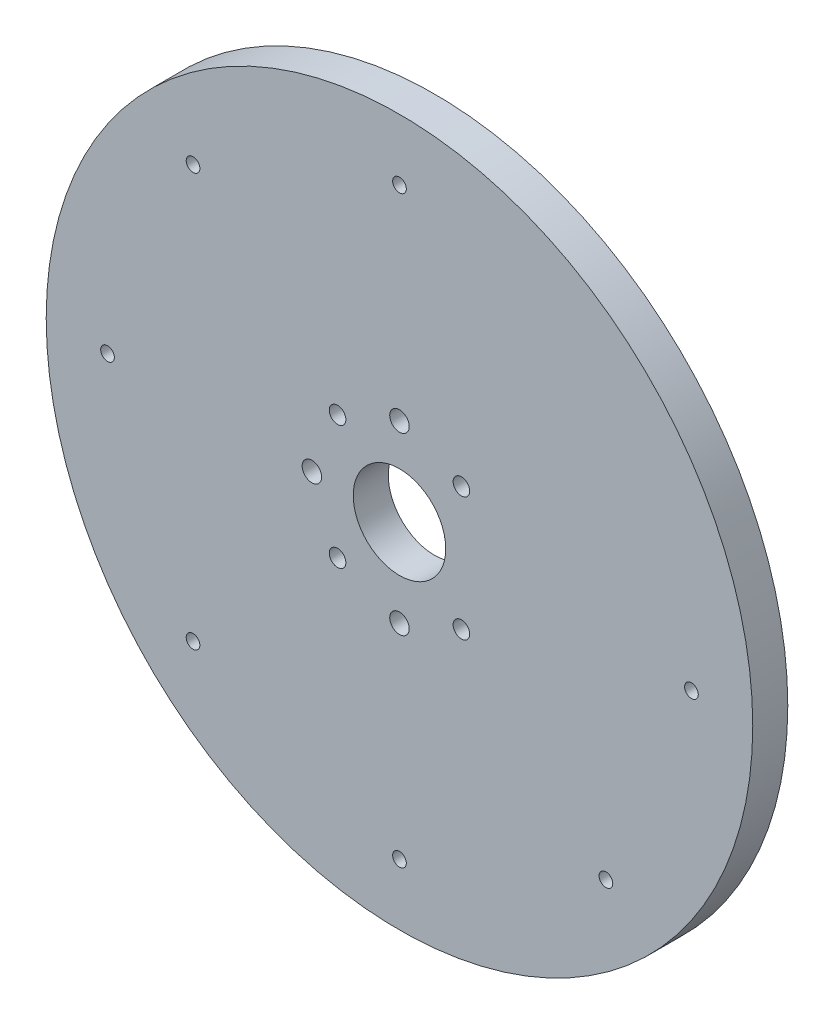
ISO-10303-21;
HEADER;
FILE_DESCRIPTION(('STEP AP214'),'2;1');
FILE_NAME('part.step','',(''),(''),'','','');
FILE_SCHEMA(('AUTOMOTIVE_DESIGN { 1 0 10303 214 1 1 1 1 }'));
ENDSEC;
DATA;
#1=APPLICATION_CONTEXT('core data for automotive mechanical design processes');
#2=APPLICATION_PROTOCOL_DEFINITION('international standard','automotive_design',2000,#1);
#3=PRODUCT_CONTEXT('',#1,'mechanical');
#4=PRODUCT('Part','Part','',(#3));
#5=PRODUCT_RELATED_PRODUCT_CATEGORY('part','',(#4));
#6=PRODUCT_DEFINITION_FORMATION('','',#4);
#7=PRODUCT_DEFINITION_CONTEXT('part definition',#1,'design');
#8=PRODUCT_DEFINITION('design','',#6,#7);
#9=PRODUCT_DEFINITION_SHAPE('','',#8);
#10=(LENGTH_UNIT() NAMED_UNIT(*) SI_UNIT(.MILLI.,.METRE.));
#11=(NAMED_UNIT(*) PLANE_ANGLE_UNIT() SI_UNIT($,.RADIAN.));
#12=(NAMED_UNIT(*) SI_UNIT($,.STERADIAN.) SOLID_ANGLE_UNIT());
#13=UNCERTAINTY_MEASURE_WITH_UNIT(LENGTH_MEASURE(1.E-05),#10,'distance_accuracy_value','');
#14=(GEOMETRIC_REPRESENTATION_CONTEXT(3) GLOBAL_UNCERTAINTY_ASSIGNED_CONTEXT((#13)) GLOBAL_UNIT_ASSIGNED_CONTEXT((#10,
#11,#12)) REPRESENTATION_CONTEXT('',''));
#15=CARTESIAN_POINT('',(0.,0.,0.));
#16=DIRECTION('',(0.,0.,1.));
#17=DIRECTION('',(1.,0.,0.));
#18=AXIS2_PLACEMENT_3D('',#15,#16,#17);
#19=CARTESIAN_POINT('',(0.,0.,6.));
#20=DIRECTION('',(0.,0.,1.));
#21=DIRECTION('',(1.,0.,0.));
#22=AXIS2_PLACEMENT_3D('',#19,#20,#21);
#23=PLANE('',#22);
#24=CARTESIAN_POINT('',(1.68358407260694E-13,50.,6.));
#25=DIRECTION('',(0.,0.,1.));
#26=DIRECTION('',(1.,0.,0.));
#27=AXIS2_PLACEMENT_3D('',#24,#25,#26);
#28=CIRCLE('',#27,1.17);
#29=CARTESIAN_POINT('',(1.17000000000017,50.,6.));
#30=VERTEX_POINT('',#29);
#31=EDGE_CURVE('E60',#30,#30,#28,.T.);
#32=ORIENTED_EDGE('',*,*,#31,.F.);
#33=EDGE_LOOP('',(#32));
#34=FACE_BOUND('',#33,.T.);
#35=CARTESIAN_POINT('',(-50.,1.74574066942157E-13,6.));
#36=DIRECTION('',(0.,0.,1.));
#37=DIRECTION('',(1.,0.,0.));
#38=AXIS2_PLACEMENT_3D('',#35,#36,#37);
#39=CIRCLE('',#38,1.17);
#40=CARTESIAN_POINT('',(-48.83,1.74574066942157E-13,6.));
#41=VERTEX_POINT('',#40);
#42=EDGE_CURVE('E72',#41,#41,#39,.T.);
#43=ORIENTED_EDGE('',*,*,#42,.F.);
#44=EDGE_LOOP('',(#43));
#45=FACE_BOUND('',#44,.T.);
#46=CARTESIAN_POINT('',(-10.6066017177982,10.6066017177983,6.));
#47=DIRECTION('',(0.,0.,1.));
#48=DIRECTION('',(1.,0.,0.));
#49=AXIS2_PLACEMENT_3D('',#46,#47,#48);
#50=CIRCLE('',#49,1.42);
#51=CARTESIAN_POINT('',(-9.18660171779816,10.6066017177983,6.));
#52=VERTEX_POINT('',#51);
#53=EDGE_CURVE('E84',#52,#52,#50,.T.);
#54=ORIENTED_EDGE('',*,*,#53,.F.);
#55=EDGE_LOOP('',(#54));
#56=FACE_BOUND('',#55,.T.);
#57=CARTESIAN_POINT('',(-10.6066017177982,-10.6066017177982,6.));
#58=DIRECTION('',(0.,0.,1.));
#59=DIRECTION('',(1.,0.,0.));
#60=AXIS2_PLACEMENT_3D('',#57,#58,#59);
#61=CIRCLE('',#60,1.42);
#62=CARTESIAN_POINT('',(-9.18660171779823,-10.6066017177982,6.));
#63=VERTEX_POINT('',#62);
#64=EDGE_CURVE('E96',#63,#63,#61,.T.);
#65=ORIENTED_EDGE('',*,*,#64,.F.);
#66=EDGE_LOOP('',(#65));
#67=FACE_BOUND('',#66,.T.);
#68=CARTESIAN_POINT('',(-35.3553390593274,-35.3553390593273,6.));
#69=DIRECTION('',(0.,0.,1.));
#70=DIRECTION('',(1.,0.,0.));
#71=AXIS2_PLACEMENT_3D('',#68,#69,#70);
#72=CIRCLE('',#71,1.17);
#73=CARTESIAN_POINT('',(-34.1853390593274,-35.3553390593273,6.));
#74=VERTEX_POINT('',#73);
#75=EDGE_CURVE('E108',#74,#74,#72,.T.);
#76=ORIENTED_EDGE('',*,*,#75,.F.);
#77=EDGE_LOOP('',(#76));
#78=FACE_BOUND('',#77,.T.);
#79=CARTESIAN_POINT('',(10.6066017177982,-10.6066017177982,6.));
#80=DIRECTION('',(0.,0.,1.));
#81=DIRECTION('',(1.,0.,0.));
#82=AXIS2_PLACEMENT_3D('',#79,#80,#81);
#83=CIRCLE('',#82,1.42);
#84=CARTESIAN_POINT('',(12.0266017177982,-10.6066017177982,6.));
#85=VERTEX_POINT('',#84);
#86=EDGE_CURVE('E120',#85,#85,#83,.T.);
#87=ORIENTED_EDGE('',*,*,#86,.F.);
#88=EDGE_LOOP('',(#87));
#89=FACE_BOUND('',#88,.T.);
#90=CARTESIAN_POINT('',(0.,0.,6.));
#91=DIRECTION('',(0.,0.,1.));
#92=DIRECTION('',(1.,0.,0.));
#93=AXIS2_PLACEMENT_3D('',#90,#91,#92);
#94=CIRCLE('',#93,7.92);
#95=CARTESIAN_POINT('',(7.92,0.,6.));
#96=VERTEX_POINT('',#95);
#97=EDGE_CURVE('E52',#96,#96,#94,.T.);
#98=ORIENTED_EDGE('',*,*,#97,.F.);
#99=EDGE_LOOP('',(#98));
#100=FACE_BOUND('',#99,.T.);
#101=CARTESIAN_POINT('',(0.,0.,6.));
#102=DIRECTION('',(0.,0.,1.));
#103=DIRECTION('',(1.,0.,0.));
#104=AXIS2_PLACEMENT_3D('',#101,#102,#103);
#105=CIRCLE('',#104,60.5);
#106=CARTESIAN_POINT('',(60.5,0.,6.));
#107=VERTEX_POINT('',#106);
#108=EDGE_CURVE('E11',#107,#107,#105,.T.);
#109=ORIENTED_EDGE('',*,*,#108,.T.);
#110=EDGE_LOOP('',(#109));
#111=FACE_BOUND('',#110,.T.);
#112=CARTESIAN_POINT('',(35.3553390593276,-35.3553390593272,6.));
#113=DIRECTION('',(0.,0.,1.));
#114=DIRECTION('',(1.,0.,0.));
#115=AXIS2_PLACEMENT_3D('',#112,#113,#114);
#116=CIRCLE('',#115,1.17);
#117=CARTESIAN_POINT('',(36.5253390593276,-35.3553390593272,6.));
#118=VERTEX_POINT('',#117);
#119=EDGE_CURVE('E44',#118,#118,#116,.T.);
#120=ORIENTED_EDGE('',*,*,#119,.F.);
#121=EDGE_LOOP('',(#120));
#122=FACE_BOUND('',#121,.T.);
#123=CARTESIAN_POINT('',(0.,-15.,6.));
#124=DIRECTION('',(0.,0.,1.));
#125=DIRECTION('',(1.,0.,0.));
#126=AXIS2_PLACEMENT_3D('',#123,#124,#125);
#127=CIRCLE('',#126,1.67);
#128=CARTESIAN_POINT('',(1.67,-15.,6.));
#129=VERTEX_POINT('',#128);
#130=EDGE_CURVE('E126',#129,#129,#127,.T.);
#131=ORIENTED_EDGE('',*,*,#130,.F.);
#132=EDGE_LOOP('',(#131));
#133=FACE_BOUND('',#132,.T.);
#134=CARTESIAN_POINT('',(0.,-50.,6.));
#135=DIRECTION('',(0.,0.,1.));
#136=DIRECTION('',(1.,0.,0.));
#137=AXIS2_PLACEMENT_3D('',#134,#135,#136);
#138=CIRCLE('',#137,1.17);
#139=CARTESIAN_POINT('',(1.17,-50.,6.));
#140=VERTEX_POINT('',#139);
#141=EDGE_CURVE('E114',#140,#140,#138,.T.);
#142=ORIENTED_EDGE('',*,*,#141,.F.);
#143=EDGE_LOOP('',(#142));
#144=FACE_BOUND('',#143,.T.);
#145=CARTESIAN_POINT('',(-15.,0.,6.));
#146=DIRECTION('',(0.,0.,1.));
#147=DIRECTION('',(1.,0.,0.));
#148=AXIS2_PLACEMENT_3D('',#145,#146,#147);
#149=CIRCLE('',#148,1.67);
#150=CARTESIAN_POINT('',(-13.33,0.,6.));
#151=VERTEX_POINT('',#150);
#152=EDGE_CURVE('E102',#151,#151,#149,.T.);
#153=ORIENTED_EDGE('',*,*,#152,.F.);
#154=EDGE_LOOP('',(#153));
#155=FACE_BOUND('',#154,.T.);
#156=CARTESIAN_POINT('',(1.04744440165294E-13,15.,6.));
#157=DIRECTION('',(0.,0.,1.));
#158=DIRECTION('',(1.,0.,0.));
#159=AXIS2_PLACEMENT_3D('',#156,#157,#158);
#160=CIRCLE('',#159,1.67);
#161=CARTESIAN_POINT('',(1.6700000000001,15.,6.));
#162=VERTEX_POINT('',#161);
#163=EDGE_CURVE('E90',#162,#162,#160,.T.);
#164=ORIENTED_EDGE('',*,*,#163,.F.);
#165=EDGE_LOOP('',(#164));
#166=FACE_BOUND('',#165,.T.);
#167=CARTESIAN_POINT('',(10.6066017177983,10.6066017177981,6.));
#168=DIRECTION('',(0.,0.,1.));
#169=DIRECTION('',(1.,0.,0.));
#170=AXIS2_PLACEMENT_3D('',#167,#168,#169);
#171=CIRCLE('',#170,1.42);
#172=CARTESIAN_POINT('',(12.0266017177983,10.6066017177981,6.));
#173=VERTEX_POINT('',#172);
#174=EDGE_CURVE('E78',#173,#173,#171,.T.);
#175=ORIENTED_EDGE('',*,*,#174,.F.);
#176=EDGE_LOOP('',(#175));
#177=FACE_BOUND('',#176,.T.);
#178=CARTESIAN_POINT('',(-35.3553390593272,35.3553390593276,6.));
#179=DIRECTION('',(0.,0.,1.));
#180=DIRECTION('',(1.,0.,0.));
#181=AXIS2_PLACEMENT_3D('',#178,#179,#180);
#182=CIRCLE('',#181,1.17);
#183=CARTESIAN_POINT('',(-34.1853390593272,35.3553390593276,6.));
#184=VERTEX_POINT('',#183);
#185=EDGE_CURVE('E66',#184,#184,#182,.T.);
#186=ORIENTED_EDGE('',*,*,#185,.F.);
#187=EDGE_LOOP('',(#186));
#188=FACE_BOUND('',#187,.T.);
#189=CARTESIAN_POINT('',(50.,0.,6.));
#190=DIRECTION('',(0.,0.,1.));
#191=DIRECTION('',(1.,0.,0.));
#192=AXIS2_PLACEMENT_3D('',#189,#190,#191);
#193=CIRCLE('',#192,1.17);
#194=CARTESIAN_POINT('',(51.17,0.,6.));
#195=VERTEX_POINT('',#194);
#196=EDGE_CURVE('E53',#195,#195,#193,.T.);
#197=ORIENTED_EDGE('',*,*,#196,.F.);
#198=EDGE_LOOP('',(#197));
#199=FACE_BOUND('',#198,.T.);
#200=ADVANCED_FACE('F31',(#34,#45,#56,#67,#78,#89,#100,#111,#122,#133,#144,#155,#166,#177,#188,
#199),#23,.T.);
#201=CARTESIAN_POINT('',(0.,0.,0.));
#202=DIRECTION('',(0.,0.,1.));
#203=DIRECTION('',(1.,0.,0.));
#204=AXIS2_PLACEMENT_3D('',#201,#202,#203);
#205=PLANE('',#204);
#206=CARTESIAN_POINT('',(1.68358407260694E-13,50.,0.));
#207=DIRECTION('',(0.,0.,1.));
#208=DIRECTION('',(1.,0.,0.));
#209=AXIS2_PLACEMENT_3D('',#206,#207,#208);
#210=CIRCLE('',#209,1.17);
#211=CARTESIAN_POINT('',(1.17000000000017,50.,0.));
#212=VERTEX_POINT('',#211);
#213=EDGE_CURVE('E56',#212,#212,#210,.T.);
#214=ORIENTED_EDGE('',*,*,#213,.T.);
#215=EDGE_LOOP('',(#214));
#216=FACE_BOUND('',#215,.T.);
#217=CARTESIAN_POINT('',(-50.,1.74574066942157E-13,0.));
#218=DIRECTION('',(0.,0.,1.));
#219=DIRECTION('',(1.,0.,0.));
#220=AXIS2_PLACEMENT_3D('',#217,#218,#219);
#221=CIRCLE('',#220,1.17);
#222=CARTESIAN_POINT('',(-48.83,1.74574066942157E-13,0.));
#223=VERTEX_POINT('',#222);
#224=EDGE_CURVE('E69',#223,#223,#221,.T.);
#225=ORIENTED_EDGE('',*,*,#224,.T.);
#226=EDGE_LOOP('',(#225));
#227=FACE_BOUND('',#226,.T.);
#228=CARTESIAN_POINT('',(-10.6066017177982,10.6066017177983,0.));
#229=DIRECTION('',(0.,0.,1.));
#230=DIRECTION('',(1.,0.,0.));
#231=AXIS2_PLACEMENT_3D('',#228,#229,#230);
#232=CIRCLE('',#231,1.42);
#233=CARTESIAN_POINT('',(-9.18660171779816,10.6066017177983,0.));
#234=VERTEX_POINT('',#233);
#235=EDGE_CURVE('E81',#234,#234,#232,.T.);
#236=ORIENTED_EDGE('',*,*,#235,.T.);
#237=EDGE_LOOP('',(#236));
#238=FACE_BOUND('',#237,.T.);
#239=CARTESIAN_POINT('',(-10.6066017177982,-10.6066017177982,0.));
#240=DIRECTION('',(0.,0.,1.));
#241=DIRECTION('',(1.,0.,0.));
#242=AXIS2_PLACEMENT_3D('',#239,#240,#241);
#243=CIRCLE('',#242,1.42);
#244=CARTESIAN_POINT('',(-9.18660171779823,-10.6066017177982,0.));
#245=VERTEX_POINT('',#244);
#246=EDGE_CURVE('E93',#245,#245,#243,.T.);
#247=ORIENTED_EDGE('',*,*,#246,.T.);
#248=EDGE_LOOP('',(#247));
#249=FACE_BOUND('',#248,.T.);
#250=CARTESIAN_POINT('',(-35.3553390593274,-35.3553390593273,0.));
#251=DIRECTION('',(0.,0.,1.));
#252=DIRECTION('',(1.,0.,0.));
#253=AXIS2_PLACEMENT_3D('',#250,#251,#252);
#254=CIRCLE('',#253,1.17);
#255=CARTESIAN_POINT('',(-34.1853390593274,-35.3553390593273,0.));
#256=VERTEX_POINT('',#255);
#257=EDGE_CURVE('E105',#256,#256,#254,.T.);
#258=ORIENTED_EDGE('',*,*,#257,.T.);
#259=EDGE_LOOP('',(#258));
#260=FACE_BOUND('',#259,.T.);
#261=CARTESIAN_POINT('',(10.6066017177982,-10.6066017177982,0.));
#262=DIRECTION('',(0.,0.,1.));
#263=DIRECTION('',(1.,0.,0.));
#264=AXIS2_PLACEMENT_3D('',#261,#262,#263);
#265=CIRCLE('',#264,1.42);
#266=CARTESIAN_POINT('',(12.0266017177982,-10.6066017177982,0.));
#267=VERTEX_POINT('',#266);
#268=EDGE_CURVE('E117',#267,#267,#265,.T.);
#269=ORIENTED_EDGE('',*,*,#268,.T.);
#270=EDGE_LOOP('',(#269));
#271=FACE_BOUND('',#270,.T.);
#272=CARTESIAN_POINT('',(0.,0.,0.));
#273=DIRECTION('',(0.,0.,1.));
#274=DIRECTION('',(1.,0.,0.));
#275=AXIS2_PLACEMENT_3D('',#272,#273,#274);
#276=CIRCLE('',#275,7.92);
#277=CARTESIAN_POINT('',(7.92,0.,0.));
#278=VERTEX_POINT('',#277);
#279=EDGE_CURVE('E35',#278,#278,#276,.T.);
#280=ORIENTED_EDGE('',*,*,#279,.T.);
#281=EDGE_LOOP('',(#280));
#282=FACE_BOUND('',#281,.T.);
#283=CARTESIAN_POINT('',(0.,0.,0.));
#284=DIRECTION('',(0.,0.,1.));
#285=DIRECTION('',(1.,0.,0.));
#286=AXIS2_PLACEMENT_3D('',#283,#284,#285);
#287=CIRCLE('',#286,60.5);
#288=CARTESIAN_POINT('',(60.5,0.,0.));
#289=VERTEX_POINT('',#288);
#290=EDGE_CURVE('E39',#289,#289,#287,.T.);
#291=ORIENTED_EDGE('',*,*,#290,.F.);
#292=EDGE_LOOP('',(#291));
#293=FACE_BOUND('',#292,.T.);
#294=CARTESIAN_POINT('',(35.3553390593276,-35.3553390593272,0.));
#295=DIRECTION('',(0.,0.,1.));
#296=DIRECTION('',(1.,0.,0.));
#297=AXIS2_PLACEMENT_3D('',#294,#295,#296);
#298=CIRCLE('',#297,1.17);
#299=CARTESIAN_POINT('',(36.5253390593276,-35.3553390593272,0.));
#300=VERTEX_POINT('',#299);
#301=EDGE_CURVE('E49',#300,#300,#298,.T.);
#302=ORIENTED_EDGE('',*,*,#301,.T.);
#303=EDGE_LOOP('',(#302));
#304=FACE_BOUND('',#303,.T.);
#305=CARTESIAN_POINT('',(0.,-15.,0.));
#306=DIRECTION('',(0.,0.,1.));
#307=DIRECTION('',(1.,0.,0.));
#308=AXIS2_PLACEMENT_3D('',#305,#306,#307);
#309=CIRCLE('',#308,1.67);
#310=CARTESIAN_POINT('',(1.67,-15.,0.));
#311=VERTEX_POINT('',#310);
#312=EDGE_CURVE('E123',#311,#311,#309,.T.);
#313=ORIENTED_EDGE('',*,*,#312,.T.);
#314=EDGE_LOOP('',(#313));
#315=FACE_BOUND('',#314,.T.);
#316=CARTESIAN_POINT('',(0.,-50.,0.));
#317=DIRECTION('',(0.,0.,1.));
#318=DIRECTION('',(1.,0.,0.));
#319=AXIS2_PLACEMENT_3D('',#316,#317,#318);
#320=CIRCLE('',#319,1.17);
#321=CARTESIAN_POINT('',(1.17,-50.,0.));
#322=VERTEX_POINT('',#321);
#323=EDGE_CURVE('E111',#322,#322,#320,.T.);
#324=ORIENTED_EDGE('',*,*,#323,.T.);
#325=EDGE_LOOP('',(#324));
#326=FACE_BOUND('',#325,.T.);
#327=CARTESIAN_POINT('',(-15.,0.,0.));
#328=DIRECTION('',(0.,0.,1.));
#329=DIRECTION('',(1.,0.,0.));
#330=AXIS2_PLACEMENT_3D('',#327,#328,#329);
#331=CIRCLE('',#330,1.67);
#332=CARTESIAN_POINT('',(-13.33,0.,0.));
#333=VERTEX_POINT('',#332);
#334=EDGE_CURVE('E99',#333,#333,#331,.T.);
#335=ORIENTED_EDGE('',*,*,#334,.T.);
#336=EDGE_LOOP('',(#335));
#337=FACE_BOUND('',#336,.T.);
#338=CARTESIAN_POINT('',(1.04744440165294E-13,15.,0.));
#339=DIRECTION('',(0.,0.,1.));
#340=DIRECTION('',(1.,0.,0.));
#341=AXIS2_PLACEMENT_3D('',#338,#339,#340);
#342=CIRCLE('',#341,1.67);
#343=CARTESIAN_POINT('',(1.6700000000001,15.,0.));
#344=VERTEX_POINT('',#343);
#345=EDGE_CURVE('E87',#344,#344,#342,.T.);
#346=ORIENTED_EDGE('',*,*,#345,.T.);
#347=EDGE_LOOP('',(#346));
#348=FACE_BOUND('',#347,.T.);
#349=CARTESIAN_POINT('',(10.6066017177983,10.6066017177981,0.));
#350=DIRECTION('',(0.,0.,1.));
#351=DIRECTION('',(1.,0.,0.));
#352=AXIS2_PLACEMENT_3D('',#349,#350,#351);
#353=CIRCLE('',#352,1.42);
#354=CARTESIAN_POINT('',(12.0266017177983,10.6066017177981,0.));
#355=VERTEX_POINT('',#354);
#356=EDGE_CURVE('E75',#355,#355,#353,.T.);
#357=ORIENTED_EDGE('',*,*,#356,.T.);
#358=EDGE_LOOP('',(#357));
#359=FACE_BOUND('',#358,.T.);
#360=CARTESIAN_POINT('',(-35.3553390593272,35.3553390593276,0.));
#361=DIRECTION('',(0.,0.,1.));
#362=DIRECTION('',(1.,0.,0.));
#363=AXIS2_PLACEMENT_3D('',#360,#361,#362);
#364=CIRCLE('',#363,1.17);
#365=CARTESIAN_POINT('',(-34.1853390593272,35.3553390593276,0.));
#366=VERTEX_POINT('',#365);
#367=EDGE_CURVE('E63',#366,#366,#364,.T.);
#368=ORIENTED_EDGE('',*,*,#367,.T.);
#369=EDGE_LOOP('',(#368));
#370=FACE_BOUND('',#369,.T.);
#371=CARTESIAN_POINT('',(50.,0.,0.));
#372=DIRECTION('',(0.,0.,1.));
#373=DIRECTION('',(1.,0.,0.));
#374=AXIS2_PLACEMENT_3D('',#371,#372,#373);
#375=CIRCLE('',#374,1.17);
#376=CARTESIAN_POINT('',(51.17,0.,0.));
#377=VERTEX_POINT('',#376);
#378=EDGE_CURVE('E57',#377,#377,#375,.T.);
#379=ORIENTED_EDGE('',*,*,#378,.T.);
#380=EDGE_LOOP('',(#379));
#381=FACE_BOUND('',#380,.T.);
#382=ADVANCED_FACE('F136',(#216,#227,#238,#249,#260,#271,#282,#293,#304,#315,#326,#337,#348,
#359,#370,#381),#205,.F.);
#383=CARTESIAN_POINT('',(0.,0.,6.));
#384=DIRECTION('',(0.,0.,-1.));
#385=DIRECTION('',(-1.,0.,0.));
#386=AXIS2_PLACEMENT_3D('',#383,#384,#385);
#387=CYLINDRICAL_SURFACE('',#386,60.5);
#388=ORIENTED_EDGE('',*,*,#108,.F.);
#389=EDGE_LOOP('',(#388));
#390=FACE_BOUND('',#389,.T.);
#391=ORIENTED_EDGE('',*,*,#290,.T.);
#392=EDGE_LOOP('',(#391));
#393=FACE_BOUND('',#392,.T.);
#394=ADVANCED_FACE('F151',(#390,#393),#387,.T.);
#395=CARTESIAN_POINT('',(35.3553390593276,-35.3553390593272,6.));
#396=DIRECTION('',(0.,0.,-1.));
#397=DIRECTION('',(-1.,0.,0.));
#398=AXIS2_PLACEMENT_3D('',#395,#396,#397);
#399=CYLINDRICAL_SURFACE('',#398,1.17);
#400=ORIENTED_EDGE('',*,*,#119,.T.);
#401=EDGE_LOOP('',(#400));
#402=FACE_BOUND('',#401,.T.);
#403=ORIENTED_EDGE('',*,*,#301,.F.);
#404=EDGE_LOOP('',(#403));
#405=FACE_BOUND('',#404,.T.);
#406=ADVANCED_FACE('F142',(#402,#405),#399,.F.);
#407=CARTESIAN_POINT('',(0.,0.,6.));
#408=DIRECTION('',(0.,0.,-1.));
#409=DIRECTION('',(-1.,0.,0.));
#410=AXIS2_PLACEMENT_3D('',#407,#408,#409);
#411=CYLINDRICAL_SURFACE('',#410,7.92);
#412=ORIENTED_EDGE('',*,*,#97,.T.);
#413=EDGE_LOOP('',(#412));
#414=FACE_BOUND('',#413,.T.);
#415=ORIENTED_EDGE('',*,*,#279,.F.);
#416=EDGE_LOOP('',(#415));
#417=FACE_BOUND('',#416,.T.);
#418=ADVANCED_FACE('F139',(#414,#417),#411,.F.);
#419=CARTESIAN_POINT('',(0.,-15.,6.));
#420=DIRECTION('',(0.,0.,-1.));
#421=DIRECTION('',(-1.,0.,0.));
#422=AXIS2_PLACEMENT_3D('',#419,#420,#421);
#423=CYLINDRICAL_SURFACE('',#422,1.67);
#424=ORIENTED_EDGE('',*,*,#130,.T.);
#425=EDGE_LOOP('',(#424));
#426=FACE_BOUND('',#425,.T.);
#427=ORIENTED_EDGE('',*,*,#312,.F.);
#428=EDGE_LOOP('',(#427));
#429=FACE_BOUND('',#428,.T.);
#430=ADVANCED_FACE('F141',(#426,#429),#423,.F.);
#431=CARTESIAN_POINT('',(10.6066017177982,-10.6066017177982,6.));
#432=DIRECTION('',(0.,0.,-1.));
#433=DIRECTION('',(-1.,0.,0.));
#434=AXIS2_PLACEMENT_3D('',#431,#432,#433);
#435=CYLINDRICAL_SURFACE('',#434,1.42);
#436=ORIENTED_EDGE('',*,*,#86,.T.);
#437=EDGE_LOOP('',(#436));
#438=FACE_BOUND('',#437,.T.);
#439=ORIENTED_EDGE('',*,*,#268,.F.);
#440=EDGE_LOOP('',(#439));
#441=FACE_BOUND('',#440,.T.);
#442=ADVANCED_FACE('F148',(#438,#441),#435,.F.);
#443=CARTESIAN_POINT('',(0.,-50.,6.));
#444=DIRECTION('',(0.,0.,-1.));
#445=DIRECTION('',(-1.,0.,0.));
#446=AXIS2_PLACEMENT_3D('',#443,#444,#445);
#447=CYLINDRICAL_SURFACE('',#446,1.17);
#448=ORIENTED_EDGE('',*,*,#141,.T.);
#449=EDGE_LOOP('',(#448));
#450=FACE_BOUND('',#449,.T.);
#451=ORIENTED_EDGE('',*,*,#323,.F.);
#452=EDGE_LOOP('',(#451));
#453=FACE_BOUND('',#452,.T.);
#454=ADVANCED_FACE('F232',(#450,#453),#447,.F.);
#455=CARTESIAN_POINT('',(-35.3553390593274,-35.3553390593273,6.));
#456=DIRECTION('',(0.,0.,-1.));
#457=DIRECTION('',(-1.,0.,0.));
#458=AXIS2_PLACEMENT_3D('',#455,#456,#457);
#459=CYLINDRICAL_SURFACE('',#458,1.17);
#460=ORIENTED_EDGE('',*,*,#75,.T.);
#461=EDGE_LOOP('',(#460));
#462=FACE_BOUND('',#461,.T.);
#463=ORIENTED_EDGE('',*,*,#257,.F.);
#464=EDGE_LOOP('',(#463));
#465=FACE_BOUND('',#464,.T.);
#466=ADVANCED_FACE('F228',(#462,#465),#459,.F.);
#467=CARTESIAN_POINT('',(-15.,0.,6.));
#468=DIRECTION('',(0.,0.,-1.));
#469=DIRECTION('',(-1.,0.,0.));
#470=AXIS2_PLACEMENT_3D('',#467,#468,#469);
#471=CYLINDRICAL_SURFACE('',#470,1.67);
#472=ORIENTED_EDGE('',*,*,#152,.T.);
#473=EDGE_LOOP('',(#472));
#474=FACE_BOUND('',#473,.T.);
#475=ORIENTED_EDGE('',*,*,#334,.F.);
#476=EDGE_LOOP('',(#475));
#477=FACE_BOUND('',#476,.T.);
#478=ADVANCED_FACE('F224',(#474,#477),#471,.F.);
#479=CARTESIAN_POINT('',(-10.6066017177982,-10.6066017177982,6.));
#480=DIRECTION('',(0.,0.,-1.));
#481=DIRECTION('',(-1.,0.,0.));
#482=AXIS2_PLACEMENT_3D('',#479,#480,#481);
#483=CYLINDRICAL_SURFACE('',#482,1.42);
#484=ORIENTED_EDGE('',*,*,#64,.T.);
#485=EDGE_LOOP('',(#484));
#486=FACE_BOUND('',#485,.T.);
#487=ORIENTED_EDGE('',*,*,#246,.F.);
#488=EDGE_LOOP('',(#487));
#489=FACE_BOUND('',#488,.T.);
#490=ADVANCED_FACE('F220',(#486,#489),#483,.F.);
#491=CARTESIAN_POINT('',(1.04744440165294E-13,15.,6.));
#492=DIRECTION('',(0.,0.,-1.));
#493=DIRECTION('',(-1.,0.,0.));
#494=AXIS2_PLACEMENT_3D('',#491,#492,#493);
#495=CYLINDRICAL_SURFACE('',#494,1.67);
#496=ORIENTED_EDGE('',*,*,#163,.T.);
#497=EDGE_LOOP('',(#496));
#498=FACE_BOUND('',#497,.T.);
#499=ORIENTED_EDGE('',*,*,#345,.F.);
#500=EDGE_LOOP('',(#499));
#501=FACE_BOUND('',#500,.T.);
#502=ADVANCED_FACE('F216',(#498,#501),#495,.F.);
#503=CARTESIAN_POINT('',(-10.6066017177982,10.6066017177983,6.));
#504=DIRECTION('',(0.,0.,-1.));
#505=DIRECTION('',(-1.,0.,0.));
#506=AXIS2_PLACEMENT_3D('',#503,#504,#505);
#507=CYLINDRICAL_SURFACE('',#506,1.42);
#508=ORIENTED_EDGE('',*,*,#53,.T.);
#509=EDGE_LOOP('',(#508));
#510=FACE_BOUND('',#509,.T.);
#511=ORIENTED_EDGE('',*,*,#235,.F.);
#512=EDGE_LOOP('',(#511));
#513=FACE_BOUND('',#512,.T.);
#514=ADVANCED_FACE('F212',(#510,#513),#507,.F.);
#515=CARTESIAN_POINT('',(10.6066017177983,10.6066017177981,6.));
#516=DIRECTION('',(0.,0.,-1.));
#517=DIRECTION('',(-1.,0.,0.));
#518=AXIS2_PLACEMENT_3D('',#515,#516,#517);
#519=CYLINDRICAL_SURFACE('',#518,1.42);
#520=ORIENTED_EDGE('',*,*,#174,.T.);
#521=EDGE_LOOP('',(#520));
#522=FACE_BOUND('',#521,.T.);
#523=ORIENTED_EDGE('',*,*,#356,.F.);
#524=EDGE_LOOP('',(#523));
#525=FACE_BOUND('',#524,.T.);
#526=ADVANCED_FACE('F208',(#522,#525),#519,.F.);
#527=CARTESIAN_POINT('',(-50.,1.74574066942157E-13,6.));
#528=DIRECTION('',(0.,0.,-1.));
#529=DIRECTION('',(-1.,0.,0.));
#530=AXIS2_PLACEMENT_3D('',#527,#528,#529);
#531=CYLINDRICAL_SURFACE('',#530,1.17);
#532=ORIENTED_EDGE('',*,*,#42,.T.);
#533=EDGE_LOOP('',(#532));
#534=FACE_BOUND('',#533,.T.);
#535=ORIENTED_EDGE('',*,*,#224,.F.);
#536=EDGE_LOOP('',(#535));
#537=FACE_BOUND('',#536,.T.);
#538=ADVANCED_FACE('F201',(#534,#537),#531,.F.);
#539=CARTESIAN_POINT('',(-35.3553390593272,35.3553390593276,6.));
#540=DIRECTION('',(0.,0.,-1.));
#541=DIRECTION('',(-1.,0.,0.));
#542=AXIS2_PLACEMENT_3D('',#539,#540,#541);
#543=CYLINDRICAL_SURFACE('',#542,1.17);
#544=ORIENTED_EDGE('',*,*,#185,.T.);
#545=EDGE_LOOP('',(#544));
#546=FACE_BOUND('',#545,.T.);
#547=ORIENTED_EDGE('',*,*,#367,.F.);
#548=EDGE_LOOP('',(#547));
#549=FACE_BOUND('',#548,.T.);
#550=ADVANCED_FACE('F194',(#546,#549),#543,.F.);
#551=CARTESIAN_POINT('',(1.68358407260694E-13,50.,6.));
#552=DIRECTION('',(0.,0.,-1.));
#553=DIRECTION('',(-1.,0.,0.));
#554=AXIS2_PLACEMENT_3D('',#551,#552,#553);
#555=CYLINDRICAL_SURFACE('',#554,1.17);
#556=ORIENTED_EDGE('',*,*,#31,.T.);
#557=EDGE_LOOP('',(#556));
#558=FACE_BOUND('',#557,.T.);
#559=ORIENTED_EDGE('',*,*,#213,.F.);
#560=EDGE_LOOP('',(#559));
#561=FACE_BOUND('',#560,.T.);
#562=ADVANCED_FACE('F189',(#558,#561),#555,.F.);
#563=CARTESIAN_POINT('',(50.,0.,6.));
#564=DIRECTION('',(0.,0.,-1.));
#565=DIRECTION('',(-1.,0.,0.));
#566=AXIS2_PLACEMENT_3D('',#563,#564,#565);
#567=CYLINDRICAL_SURFACE('',#566,1.17);
#568=ORIENTED_EDGE('',*,*,#196,.T.);
#569=EDGE_LOOP('',(#568));
#570=FACE_BOUND('',#569,.T.);
#571=ORIENTED_EDGE('',*,*,#378,.F.);
#572=EDGE_LOOP('',(#571));
#573=FACE_BOUND('',#572,.T.);
#574=ADVANCED_FACE('F33',(#570,#573),#567,.F.);
#575=CLOSED_SHELL('',(#200,#382,#394,#406,#418,#430,#442,#454,#466,#478,#490,#502,#514,#526,
#538,#550,#562,#574));
#576=MANIFOLD_SOLID_BREP('B2',#575);
#577=ADVANCED_BREP_SHAPE_REPRESENTATION('',(#18,#576),#14);
#578=SHAPE_DEFINITION_REPRESENTATION(#9,#577);
ENDSEC;
END-ISO-10303-21;
